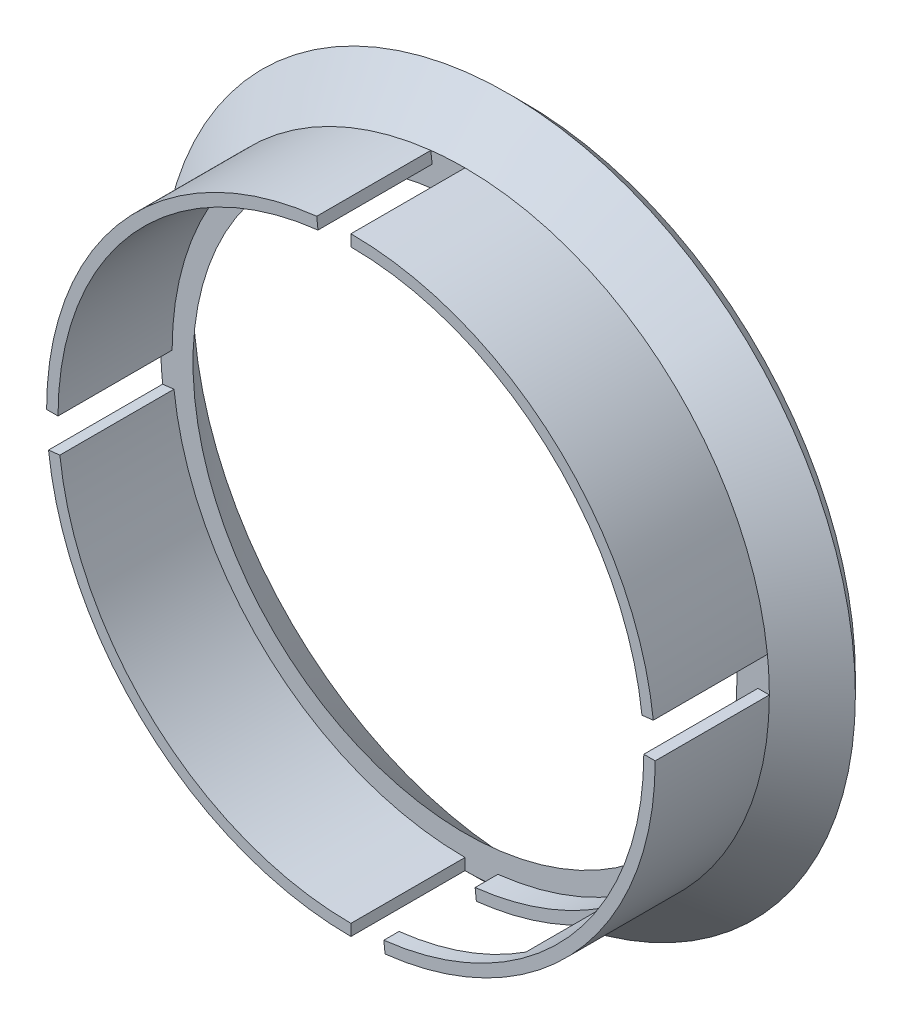
ISO-10303-21;
HEADER;
FILE_DESCRIPTION(('STEP AP214'),'2;1');
FILE_NAME('part.step','',(''),(''),'','','');
FILE_SCHEMA(('AUTOMOTIVE_DESIGN { 1 0 10303 214 1 1 1 1 }'));
ENDSEC;
DATA;
#1=APPLICATION_CONTEXT('core data for automotive mechanical design processes');
#2=APPLICATION_PROTOCOL_DEFINITION('international standard','automotive_design',2000,#1);
#3=PRODUCT_CONTEXT('',#1,'mechanical');
#4=PRODUCT('Part','Part','',(#3));
#5=PRODUCT_RELATED_PRODUCT_CATEGORY('part','',(#4));
#6=PRODUCT_DEFINITION_FORMATION('','',#4);
#7=PRODUCT_DEFINITION_CONTEXT('part definition',#1,'design');
#8=PRODUCT_DEFINITION('design','',#6,#7);
#9=PRODUCT_DEFINITION_SHAPE('','',#8);
#10=(LENGTH_UNIT() NAMED_UNIT(*) SI_UNIT(.MILLI.,.METRE.));
#11=(NAMED_UNIT(*) PLANE_ANGLE_UNIT() SI_UNIT($,.RADIAN.));
#12=(NAMED_UNIT(*) SI_UNIT($,.STERADIAN.) SOLID_ANGLE_UNIT());
#13=UNCERTAINTY_MEASURE_WITH_UNIT(LENGTH_MEASURE(1.E-05),#10,'distance_accuracy_value','');
#14=(GEOMETRIC_REPRESENTATION_CONTEXT(3) GLOBAL_UNCERTAINTY_ASSIGNED_CONTEXT((#13)) GLOBAL_UNIT_ASSIGNED_CONTEXT((#10,
#11,#12)) REPRESENTATION_CONTEXT('',''));
#15=CARTESIAN_POINT('',(0.,0.,0.));
#16=DIRECTION('',(0.,0.,1.));
#17=DIRECTION('',(1.,0.,0.));
#18=AXIS2_PLACEMENT_3D('',#15,#16,#17);
#19=CARTESIAN_POINT('',(0.,0.,15.));
#20=DIRECTION('',(-0.993671875,-0.112321880477423,0.));
#21=DIRECTION('',(0.112321880477423,-0.993671875,0.));
#22=AXIS2_PLACEMENT_3D('',#19,#20,#21);
#23=PLANE('',#22);
#24=DIRECTION('',(0.112321880477423,-0.993671875,0.));
#25=VECTOR('',#24,1.);
#26=CARTESIAN_POINT('',(5.04545822385321,-44.6353810336905,13.));
#27=LINE('',#26,#25);
#28=CARTESIAN_POINT('',(4.32439239838076,-38.2563671875,13.));
#29=VERTEX_POINT('',#28);
#30=CARTESIAN_POINT('',(4.4928752190969,-39.746875,13.));
#31=VERTEX_POINT('',#30);
#32=EDGE_CURVE('E190',#29,#31,#27,.T.);
#33=ORIENTED_EDGE('',*,*,#32,.T.);
#34=DIRECTION('',(0.,0.,-1.));
#35=VECTOR('',#34,1.);
#36=CARTESIAN_POINT('',(4.4928752190969,-39.746875,15.));
#37=LINE('',#36,#35);
#38=CARTESIAN_POINT('',(4.4928752190969,-39.746875,15.));
#39=VERTEX_POINT('',#38);
#40=EDGE_CURVE('E203',#39,#31,#37,.T.);
#41=ORIENTED_EDGE('',*,*,#40,.F.);
#42=DIRECTION('',(-0.112321880477423,0.993671875,0.));
#43=VECTOR('',#42,1.);
#44=CARTESIAN_POINT('',(0.,0.,15.));
#45=LINE('',#44,#43);
#46=CARTESIAN_POINT('',(4.32439239838076,-38.2563671875,15.));
#47=VERTEX_POINT('',#46);
#48=EDGE_CURVE('E478',#39,#47,#45,.T.);
#49=ORIENTED_EDGE('',*,*,#48,.T.);
#50=DIRECTION('',(0.,0.,-1.));
#51=VECTOR('',#50,1.);
#52=CARTESIAN_POINT('',(4.32439239838076,-38.2563671875,15.));
#53=LINE('',#52,#51);
#54=EDGE_CURVE('E205',#47,#29,#53,.T.);
#55=ORIENTED_EDGE('',*,*,#54,.T.);
#56=EDGE_LOOP('',(#33,#41,#49,#55));
#57=FACE_BOUND('',#56,.T.);
#58=ADVANCED_FACE('F47',(#57),#23,.T.);
#59=CARTESIAN_POINT('',(0.,0.,15.));
#60=DIRECTION('',(0.,0.,-1.));
#61=DIRECTION('',(-1.,0.,0.));
#62=AXIS2_PLACEMENT_3D('',#59,#60,#61);
#63=CYLINDRICAL_SURFACE('',#62,38.5);
#64=CARTESIAN_POINT('',(0.,0.,0.));
#65=DIRECTION('',(0.,0.,1.));
#66=DIRECTION('',(1.,0.,0.));
#67=AXIS2_PLACEMENT_3D('',#64,#65,#66);
#68=CIRCLE('',#67,38.5);
#69=CARTESIAN_POINT('',(-4.32439239838076,38.2563671875,0.));
#70=VERTEX_POINT('',#69);
#71=CARTESIAN_POINT('',(-38.5,0.,0.));
#72=VERTEX_POINT('',#71);
#73=EDGE_CURVE('E329',#70,#72,#68,.T.);
#74=ORIENTED_EDGE('',*,*,#73,.F.);
#75=DIRECTION('',(0.,0.,-1.));
#76=VECTOR('',#75,1.);
#77=CARTESIAN_POINT('',(-4.32439239838076,38.2563671875,15.));
#78=LINE('',#77,#76);
#79=CARTESIAN_POINT('',(-4.32439239838076,38.2563671875,15.));
#80=VERTEX_POINT('',#79);
#81=EDGE_CURVE('E11',#80,#70,#78,.T.);
#82=ORIENTED_EDGE('',*,*,#81,.F.);
#83=CARTESIAN_POINT('',(0.,0.,15.));
#84=DIRECTION('',(0.,0.,1.));
#85=DIRECTION('',(1.,0.,0.));
#86=AXIS2_PLACEMENT_3D('',#83,#84,#85);
#87=CIRCLE('',#86,38.5);
#88=CARTESIAN_POINT('',(-38.5,0.,15.));
#89=VERTEX_POINT('',#88);
#90=EDGE_CURVE('E332',#80,#89,#87,.T.);
#91=ORIENTED_EDGE('',*,*,#90,.T.);
#92=DIRECTION('',(0.,0.,-1.));
#93=VECTOR('',#92,1.);
#94=CARTESIAN_POINT('',(-38.5,0.,15.));
#95=LINE('',#94,#93);
#96=EDGE_CURVE('E348',#89,#72,#95,.T.);
#97=ORIENTED_EDGE('',*,*,#96,.T.);
#98=EDGE_LOOP('',(#74,#82,#91,#97));
#99=FACE_BOUND('',#98,.T.);
#100=ADVANCED_FACE('F49',(#99),#63,.F.);
#101=CARTESIAN_POINT('',(0.,0.,15.));
#102=DIRECTION('',(0.993671875,0.112321880477423,0.));
#103=DIRECTION('',(-0.112321880477423,0.993671875,0.));
#104=AXIS2_PLACEMENT_3D('',#101,#102,#103);
#105=PLANE('',#104);
#106=DIRECTION('',(0.112321880477423,-0.993671875,0.));
#107=VECTOR('',#106,1.);
#108=CARTESIAN_POINT('',(0.,0.,0.));
#109=LINE('',#108,#107);
#110=CARTESIAN_POINT('',(-4.4928752190969,39.746875,0.));
#111=VERTEX_POINT('',#110);
#112=EDGE_CURVE('E352',#111,#70,#109,.T.);
#113=ORIENTED_EDGE('',*,*,#112,.F.);
#114=DIRECTION('',(0.,0.,-1.));
#115=VECTOR('',#114,1.);
#116=CARTESIAN_POINT('',(-4.4928752190969,39.746875,15.));
#117=LINE('',#116,#115);
#118=CARTESIAN_POINT('',(-4.4928752190969,39.746875,15.));
#119=VERTEX_POINT('',#118);
#120=EDGE_CURVE('E56',#119,#111,#117,.T.);
#121=ORIENTED_EDGE('',*,*,#120,.F.);
#122=DIRECTION('',(0.112321880477423,-0.993671875,0.));
#123=VECTOR('',#122,1.);
#124=CARTESIAN_POINT('',(0.,0.,15.));
#125=LINE('',#124,#123);
#126=EDGE_CURVE('E336',#119,#80,#125,.T.);
#127=ORIENTED_EDGE('',*,*,#126,.T.);
#128=ORIENTED_EDGE('',*,*,#81,.T.);
#129=EDGE_LOOP('',(#113,#121,#127,#128));
#130=FACE_BOUND('',#129,.T.);
#131=ADVANCED_FACE('F377',(#130),#105,.T.);
#132=CARTESIAN_POINT('',(0.,0.,15.));
#133=DIRECTION('',(0.,0.,-1.));
#134=DIRECTION('',(-1.,0.,0.));
#135=AXIS2_PLACEMENT_3D('',#132,#133,#134);
#136=CYLINDRICAL_SURFACE('',#135,40.);
#137=CARTESIAN_POINT('',(0.,0.,0.));
#138=DIRECTION('',(0.,0.,1.));
#139=DIRECTION('',(1.,0.,0.));
#140=AXIS2_PLACEMENT_3D('',#137,#138,#139);
#141=CIRCLE('',#140,40.);
#142=CARTESIAN_POINT('',(-40.,0.,0.));
#143=VERTEX_POINT('',#142);
#144=EDGE_CURVE('E356',#111,#143,#141,.T.);
#145=ORIENTED_EDGE('',*,*,#144,.T.);
#146=DIRECTION('',(0.,0.,-1.));
#147=VECTOR('',#146,1.);
#148=CARTESIAN_POINT('',(-40.,0.,15.));
#149=LINE('',#148,#147);
#150=CARTESIAN_POINT('',(-40.,0.,15.));
#151=VERTEX_POINT('',#150);
#152=EDGE_CURVE('E365',#151,#143,#149,.T.);
#153=ORIENTED_EDGE('',*,*,#152,.F.);
#154=CARTESIAN_POINT('',(0.,0.,15.));
#155=DIRECTION('',(0.,0.,1.));
#156=DIRECTION('',(1.,0.,0.));
#157=AXIS2_PLACEMENT_3D('',#154,#155,#156);
#158=CIRCLE('',#157,40.);
#159=EDGE_CURVE('E341',#119,#151,#158,.T.);
#160=ORIENTED_EDGE('',*,*,#159,.F.);
#161=ORIENTED_EDGE('',*,*,#120,.T.);
#162=EDGE_LOOP('',(#145,#153,#160,#161));
#163=FACE_BOUND('',#162,.T.);
#164=ADVANCED_FACE('F372',(#163),#136,.T.);
#165=CARTESIAN_POINT('',(0.,0.,15.));
#166=DIRECTION('',(0.,-1.,0.));
#167=DIRECTION('',(0.,0.,-1.));
#168=AXIS2_PLACEMENT_3D('',#165,#166,#167);
#169=PLANE('',#168);
#170=DIRECTION('',(-1.,0.,0.));
#171=VECTOR('',#170,1.);
#172=CARTESIAN_POINT('',(0.,0.,0.));
#173=LINE('',#172,#171);
#174=EDGE_CURVE('E337',#72,#143,#173,.T.);
#175=ORIENTED_EDGE('',*,*,#174,.F.);
#176=ORIENTED_EDGE('',*,*,#96,.F.);
#177=DIRECTION('',(-1.,0.,0.));
#178=VECTOR('',#177,1.);
#179=CARTESIAN_POINT('',(0.,0.,15.));
#180=LINE('',#179,#178);
#181=EDGE_CURVE('E344',#89,#151,#180,.T.);
#182=ORIENTED_EDGE('',*,*,#181,.T.);
#183=ORIENTED_EDGE('',*,*,#152,.T.);
#184=EDGE_LOOP('',(#175,#176,#182,#183));
#185=FACE_BOUND('',#184,.T.);
#186=ADVANCED_FACE('F694',(#185),#169,.T.);
#187=CARTESIAN_POINT('',(0.,0.,15.));
#188=DIRECTION('',(0.,0.,1.));
#189=DIRECTION('',(1.,0.,0.));
#190=AXIS2_PLACEMENT_3D('',#187,#188,#189);
#191=PLANE('',#190);
#192=ORIENTED_EDGE('',*,*,#90,.F.);
#193=ORIENTED_EDGE('',*,*,#126,.F.);
#194=ORIENTED_EDGE('',*,*,#159,.T.);
#195=ORIENTED_EDGE('',*,*,#181,.F.);
#196=EDGE_LOOP('',(#192,#193,#194,#195));
#197=FACE_BOUND('',#196,.T.);
#198=ADVANCED_FACE('F555',(#197),#191,.T.);
#199=CARTESIAN_POINT('',(-35.7573593128807,0.,0.));
#200=DIRECTION('',(0.,0.,-1.));
#201=DIRECTION('',(-1.,0.,0.));
#202=AXIS2_PLACEMENT_3D('',#199,#200,#201);
#203=PLANE('',#202);
#204=CARTESIAN_POINT('',(0.,0.,0.));
#205=DIRECTION('',(0.,0.,1.));
#206=DIRECTION('',(1.,0.,0.));
#207=AXIS2_PLACEMENT_3D('',#204,#205,#206);
#208=CIRCLE('',#207,35.7573593128807);
#209=CARTESIAN_POINT('',(35.7573593128807,0.,0.));
#210=VERTEX_POINT('',#209);
#211=EDGE_CURVE('E312',#210,#210,#208,.T.);
#212=ORIENTED_EDGE('',*,*,#211,.F.);
#213=EDGE_LOOP('',(#212));
#214=FACE_BOUND('',#213,.T.);
#215=CARTESIAN_POINT('',(0.,0.,0.));
#216=DIRECTION('',(0.,0.,1.));
#217=DIRECTION('',(1.,0.,0.));
#218=AXIS2_PLACEMENT_3D('',#215,#216,#217);
#219=CIRCLE('',#218,40.);
#220=CARTESIAN_POINT('',(0.,-40.,0.));
#221=VERTEX_POINT('',#220);
#222=CARTESIAN_POINT('',(4.4928752190969,-39.746875,0.));
#223=VERTEX_POINT('',#222);
#224=EDGE_CURVE('E330',#221,#223,#219,.T.);
#225=ORIENTED_EDGE('',*,*,#224,.T.);
#226=DIRECTION('',(-0.112321880477423,0.993671875,0.));
#227=VECTOR('',#226,1.);
#228=CARTESIAN_POINT('',(0.,0.,0.));
#229=LINE('',#228,#227);
#230=CARTESIAN_POINT('',(4.32439239838076,-38.2563671875,0.));
#231=VERTEX_POINT('',#230);
#232=EDGE_CURVE('E453',#223,#231,#229,.T.);
#233=ORIENTED_EDGE('',*,*,#232,.T.);
#234=CARTESIAN_POINT('',(0.,0.,0.));
#235=DIRECTION('',(0.,0.,1.));
#236=DIRECTION('',(1.,0.,0.));
#237=AXIS2_PLACEMENT_3D('',#234,#235,#236);
#238=CIRCLE('',#237,38.5);
#239=CARTESIAN_POINT('',(38.5,0.,0.));
#240=VERTEX_POINT('',#239);
#241=EDGE_CURVE('E447',#231,#240,#238,.T.);
#242=ORIENTED_EDGE('',*,*,#241,.T.);
#243=DIRECTION('',(1.,0.,0.));
#244=VECTOR('',#243,1.);
#245=CARTESIAN_POINT('',(0.,0.,0.));
#246=LINE('',#245,#244);
#247=CARTESIAN_POINT('',(40.,0.,0.));
#248=VERTEX_POINT('',#247);
#249=EDGE_CURVE('E467',#240,#248,#246,.T.);
#250=ORIENTED_EDGE('',*,*,#249,.T.);
#251=CARTESIAN_POINT('',(39.746875,4.4928752190969,0.));
#252=VERTEX_POINT('',#251);
#253=EDGE_CURVE('E331',#248,#252,#219,.T.);
#254=ORIENTED_EDGE('',*,*,#253,.T.);
#255=DIRECTION('',(-0.993671875,-0.112321880477422,0.));
#256=VECTOR('',#255,1.);
#257=CARTESIAN_POINT('',(0.,0.,0.));
#258=LINE('',#257,#256);
#259=CARTESIAN_POINT('',(38.2563671875,4.32439239838076,0.));
#260=VERTEX_POINT('',#259);
#261=EDGE_CURVE('E243',#252,#260,#258,.T.);
#262=ORIENTED_EDGE('',*,*,#261,.T.);
#263=CARTESIAN_POINT('',(0.,0.,0.));
#264=DIRECTION('',(0.,0.,1.));
#265=DIRECTION('',(1.,0.,0.));
#266=AXIS2_PLACEMENT_3D('',#263,#264,#265);
#267=CIRCLE('',#266,38.5);
#268=CARTESIAN_POINT('',(0.,38.5,0.));
#269=VERTEX_POINT('',#268);
#270=EDGE_CURVE('E224',#260,#269,#267,.T.);
#271=ORIENTED_EDGE('',*,*,#270,.T.);
#272=DIRECTION('',(0.,-1.,0.));
#273=VECTOR('',#272,1.);
#274=CARTESIAN_POINT('',(0.,0.,0.));
#275=LINE('',#274,#273);
#276=CARTESIAN_POINT('',(0.,40.,0.));
#277=VERTEX_POINT('',#276);
#278=EDGE_CURVE('E230',#277,#269,#275,.T.);
#279=ORIENTED_EDGE('',*,*,#278,.F.);
#280=EDGE_CURVE('E324',#277,#111,#219,.T.);
#281=ORIENTED_EDGE('',*,*,#280,.T.);
#282=ORIENTED_EDGE('',*,*,#112,.T.);
#283=ORIENTED_EDGE('',*,*,#73,.T.);
#284=ORIENTED_EDGE('',*,*,#174,.T.);
#285=CARTESIAN_POINT('',(-39.746875,-4.4928752190969,0.));
#286=VERTEX_POINT('',#285);
#287=EDGE_CURVE('E325',#143,#286,#219,.T.);
#288=ORIENTED_EDGE('',*,*,#287,.T.);
#289=DIRECTION('',(0.993671875,0.112321880477422,0.));
#290=VECTOR('',#289,1.);
#291=CARTESIAN_POINT('',(0.,0.,0.));
#292=LINE('',#291,#290);
#293=CARTESIAN_POINT('',(-38.2563671875,-4.32439239838076,0.));
#294=VERTEX_POINT('',#293);
#295=EDGE_CURVE('E287',#286,#294,#292,.T.);
#296=ORIENTED_EDGE('',*,*,#295,.T.);
#297=CARTESIAN_POINT('',(0.,0.,0.));
#298=DIRECTION('',(0.,0.,1.));
#299=DIRECTION('',(1.,0.,0.));
#300=AXIS2_PLACEMENT_3D('',#297,#298,#299);
#301=CIRCLE('',#300,38.5);
#302=CARTESIAN_POINT('',(0.,-38.5,0.));
#303=VERTEX_POINT('',#302);
#304=EDGE_CURVE('E268',#294,#303,#301,.T.);
#305=ORIENTED_EDGE('',*,*,#304,.T.);
#306=DIRECTION('',(0.,1.,0.));
#307=VECTOR('',#306,1.);
#308=CARTESIAN_POINT('',(0.,0.,0.));
#309=LINE('',#308,#307);
#310=EDGE_CURVE('E274',#221,#303,#309,.T.);
#311=ORIENTED_EDGE('',*,*,#310,.F.);
#312=EDGE_LOOP('',(#225,#233,#242,#250,#254,#262,#271,#279,#281,#282,#283,#284,#288,#296,#305,#311));
#313=FACE_BOUND('',#312,.T.);
#314=ADVANCED_FACE('F386',(#214,#313),#203,.F.);
#315=CARTESIAN_POINT('',(0.,0.,-5.65685424949239));
#316=DIRECTION('',(0.,0.,-1.));
#317=DIRECTION('',(-1.,0.,0.));
#318=AXIS2_PLACEMENT_3D('',#315,#316,#317);
#319=CONICAL_SURFACE('',#318,45.6568542494924,0.785398163397446);
#320=ORIENTED_EDGE('',*,*,#144,.F.);
#321=ORIENTED_EDGE('',*,*,#280,.F.);
#322=CARTESIAN_POINT('',(0.,0.,0.));
#323=DIRECTION('',(0.,0.,1.));
#324=DIRECTION('',(1.,0.,0.));
#325=AXIS2_PLACEMENT_3D('',#322,#323,#324);
#326=CIRCLE('',#325,40.);
#327=EDGE_CURVE('E246',#252,#277,#326,.T.);
#328=ORIENTED_EDGE('',*,*,#327,.F.);
#329=ORIENTED_EDGE('',*,*,#253,.F.);
#330=CARTESIAN_POINT('',(0.,0.,0.));
#331=DIRECTION('',(0.,0.,1.));
#332=DIRECTION('',(1.,0.,0.));
#333=AXIS2_PLACEMENT_3D('',#330,#331,#332);
#334=CIRCLE('',#333,40.);
#335=EDGE_CURVE('E457',#223,#248,#334,.T.);
#336=ORIENTED_EDGE('',*,*,#335,.F.);
#337=ORIENTED_EDGE('',*,*,#224,.F.);
#338=CARTESIAN_POINT('',(0.,0.,0.));
#339=DIRECTION('',(0.,0.,1.));
#340=DIRECTION('',(1.,0.,0.));
#341=AXIS2_PLACEMENT_3D('',#338,#339,#340);
#342=CIRCLE('',#341,40.);
#343=EDGE_CURVE('E290',#286,#221,#342,.T.);
#344=ORIENTED_EDGE('',*,*,#343,.F.);
#345=ORIENTED_EDGE('',*,*,#287,.F.);
#346=EDGE_LOOP('',(#320,#321,#328,#329,#336,#337,#344,#345));
#347=FACE_BOUND('',#346,.T.);
#348=CARTESIAN_POINT('',(0.,0.,-5.65685424949239));
#349=DIRECTION('',(0.,0.,1.));
#350=DIRECTION('',(1.,0.,0.));
#351=AXIS2_PLACEMENT_3D('',#348,#349,#350);
#352=CIRCLE('',#351,45.6568542494924);
#353=CARTESIAN_POINT('',(45.6568542494924,0.,-5.65685424949239));
#354=VERTEX_POINT('',#353);
#355=EDGE_CURVE('E320',#354,#354,#352,.T.);
#356=ORIENTED_EDGE('',*,*,#355,.T.);
#357=EDGE_LOOP('',(#356));
#358=FACE_BOUND('',#357,.T.);
#359=ADVANCED_FACE('F381',(#347,#358),#319,.T.);
#360=CARTESIAN_POINT('',(0.,0.,-7.77817459305203));
#361=DIRECTION('',(0.,0.,1.));
#362=DIRECTION('',(1.,0.,0.));
#363=AXIS2_PLACEMENT_3D('',#360,#361,#362);
#364=CONICAL_SURFACE('',#363,43.5355339059327,0.785398163397447);
#365=ORIENTED_EDGE('',*,*,#355,.F.);
#366=EDGE_LOOP('',(#365));
#367=FACE_BOUND('',#366,.T.);
#368=CARTESIAN_POINT('',(0.,0.,-7.77817459305203));
#369=DIRECTION('',(0.,0.,1.));
#370=DIRECTION('',(1.,0.,0.));
#371=AXIS2_PLACEMENT_3D('',#368,#369,#370);
#372=CIRCLE('',#371,43.5355339059327);
#373=CARTESIAN_POINT('',(43.5355339059327,0.,-7.77817459305203));
#374=VERTEX_POINT('',#373);
#375=EDGE_CURVE('E316',#374,#374,#372,.T.);
#376=ORIENTED_EDGE('',*,*,#375,.T.);
#377=EDGE_LOOP('',(#376));
#378=FACE_BOUND('',#377,.T.);
#379=ADVANCED_FACE('F564',(#367,#378),#364,.T.);
#380=CARTESIAN_POINT('',(0.,0.,0.));
#381=DIRECTION('',(0.,0.,-1.));
#382=DIRECTION('',(-1.,0.,0.));
#383=AXIS2_PLACEMENT_3D('',#380,#381,#382);
#384=CONICAL_SURFACE('',#383,35.7573593128807,0.785398163397447);
#385=ORIENTED_EDGE('',*,*,#375,.F.);
#386=EDGE_LOOP('',(#385));
#387=FACE_BOUND('',#386,.T.);
#388=ORIENTED_EDGE('',*,*,#211,.T.);
#389=EDGE_LOOP('',(#388));
#390=FACE_BOUND('',#389,.T.);
#391=ADVANCED_FACE('F572',(#387,#390),#384,.F.);
#392=CARTESIAN_POINT('',(0.,0.,15.));
#393=DIRECTION('',(0.,0.,-1.));
#394=DIRECTION('',(-1.,0.,0.));
#395=AXIS2_PLACEMENT_3D('',#392,#393,#394);
#396=CYLINDRICAL_SURFACE('',#395,38.5);
#397=ORIENTED_EDGE('',*,*,#304,.F.);
#398=DIRECTION('',(0.,0.,-1.));
#399=VECTOR('',#398,1.);
#400=CARTESIAN_POINT('',(-38.2563671875,-4.32439239838076,15.));
#401=LINE('',#400,#399);
#402=CARTESIAN_POINT('',(-38.2563671875,-4.32439239838076,15.));
#403=VERTEX_POINT('',#402);
#404=EDGE_CURVE('E308',#403,#294,#401,.T.);
#405=ORIENTED_EDGE('',*,*,#404,.F.);
#406=CARTESIAN_POINT('',(0.,0.,15.));
#407=DIRECTION('',(0.,0.,1.));
#408=DIRECTION('',(1.,0.,0.));
#409=AXIS2_PLACEMENT_3D('',#406,#407,#408);
#410=CIRCLE('',#409,38.5);
#411=CARTESIAN_POINT('',(0.,-38.5,15.));
#412=VERTEX_POINT('',#411);
#413=EDGE_CURVE('E269',#403,#412,#410,.T.);
#414=ORIENTED_EDGE('',*,*,#413,.T.);
#415=DIRECTION('',(0.,0.,-1.));
#416=VECTOR('',#415,1.);
#417=CARTESIAN_POINT('',(0.,-38.5,15.));
#418=LINE('',#417,#416);
#419=EDGE_CURVE('E284',#412,#303,#418,.T.);
#420=ORIENTED_EDGE('',*,*,#419,.T.);
#421=EDGE_LOOP('',(#397,#405,#414,#420));
#422=FACE_BOUND('',#421,.T.);
#423=ADVANCED_FACE('F399',(#422),#396,.F.);
#424=CARTESIAN_POINT('',(0.,0.,15.));
#425=DIRECTION('',(-0.112321880477422,0.993671875,0.));
#426=DIRECTION('',(-0.993671875,-0.112321880477422,0.));
#427=AXIS2_PLACEMENT_3D('',#424,#425,#426);
#428=PLANE('',#427);
#429=ORIENTED_EDGE('',*,*,#295,.F.);
#430=DIRECTION('',(0.,0.,-1.));
#431=VECTOR('',#430,1.);
#432=CARTESIAN_POINT('',(-39.746875,-4.4928752190969,15.));
#433=LINE('',#432,#431);
#434=CARTESIAN_POINT('',(-39.746875,-4.4928752190969,15.));
#435=VERTEX_POINT('',#434);
#436=EDGE_CURVE('E304',#435,#286,#433,.T.);
#437=ORIENTED_EDGE('',*,*,#436,.F.);
#438=DIRECTION('',(0.993671875,0.112321880477422,0.));
#439=VECTOR('',#438,1.);
#440=CARTESIAN_POINT('',(0.,0.,15.));
#441=LINE('',#440,#439);
#442=EDGE_CURVE('E273',#435,#403,#441,.T.);
#443=ORIENTED_EDGE('',*,*,#442,.T.);
#444=ORIENTED_EDGE('',*,*,#404,.T.);
#445=EDGE_LOOP('',(#429,#437,#443,#444));
#446=FACE_BOUND('',#445,.T.);
#447=ADVANCED_FACE('F395',(#446),#428,.T.);
#448=CARTESIAN_POINT('',(0.,0.,15.));
#449=DIRECTION('',(0.,0.,-1.));
#450=DIRECTION('',(-1.,0.,0.));
#451=AXIS2_PLACEMENT_3D('',#448,#449,#450);
#452=CYLINDRICAL_SURFACE('',#451,40.);
#453=ORIENTED_EDGE('',*,*,#343,.T.);
#454=DIRECTION('',(0.,0.,-1.));
#455=VECTOR('',#454,1.);
#456=CARTESIAN_POINT('',(0.,-40.,15.));
#457=LINE('',#456,#455);
#458=CARTESIAN_POINT('',(0.,-40.,15.));
#459=VERTEX_POINT('',#458);
#460=EDGE_CURVE('E300',#459,#221,#457,.T.);
#461=ORIENTED_EDGE('',*,*,#460,.F.);
#462=CARTESIAN_POINT('',(0.,0.,15.));
#463=DIRECTION('',(0.,0.,1.));
#464=DIRECTION('',(1.,0.,0.));
#465=AXIS2_PLACEMENT_3D('',#462,#463,#464);
#466=CIRCLE('',#465,40.);
#467=EDGE_CURVE('E278',#435,#459,#466,.T.);
#468=ORIENTED_EDGE('',*,*,#467,.F.);
#469=ORIENTED_EDGE('',*,*,#436,.T.);
#470=EDGE_LOOP('',(#453,#461,#468,#469));
#471=FACE_BOUND('',#470,.T.);
#472=ADVANCED_FACE('F391',(#471),#452,.T.);
#473=CARTESIAN_POINT('',(0.,0.,15.));
#474=DIRECTION('',(-1.,0.,0.));
#475=DIRECTION('',(0.,0.,1.));
#476=AXIS2_PLACEMENT_3D('',#473,#474,#475);
#477=PLANE('',#476);
#478=ORIENTED_EDGE('',*,*,#310,.T.);
#479=ORIENTED_EDGE('',*,*,#419,.F.);
#480=DIRECTION('',(0.,1.,0.));
#481=VECTOR('',#480,1.);
#482=CARTESIAN_POINT('',(0.,0.,15.));
#483=LINE('',#482,#481);
#484=EDGE_CURVE('E281',#459,#412,#483,.T.);
#485=ORIENTED_EDGE('',*,*,#484,.F.);
#486=ORIENTED_EDGE('',*,*,#460,.T.);
#487=EDGE_LOOP('',(#478,#479,#485,#486));
#488=FACE_BOUND('',#487,.T.);
#489=ADVANCED_FACE('F403',(#488),#477,.F.);
#490=CARTESIAN_POINT('',(0.,0.,15.));
#491=DIRECTION('',(0.,0.,1.));
#492=DIRECTION('',(1.,0.,0.));
#493=AXIS2_PLACEMENT_3D('',#490,#491,#492);
#494=PLANE('',#493);
#495=ORIENTED_EDGE('',*,*,#413,.F.);
#496=ORIENTED_EDGE('',*,*,#442,.F.);
#497=ORIENTED_EDGE('',*,*,#467,.T.);
#498=ORIENTED_EDGE('',*,*,#484,.T.);
#499=EDGE_LOOP('',(#495,#496,#497,#498));
#500=FACE_BOUND('',#499,.T.);
#501=ADVANCED_FACE('F406',(#500),#494,.T.);
#502=CARTESIAN_POINT('',(0.,0.,15.));
#503=DIRECTION('',(0.,0.,-1.));
#504=DIRECTION('',(-1.,0.,0.));
#505=AXIS2_PLACEMENT_3D('',#502,#503,#504);
#506=CYLINDRICAL_SURFACE('',#505,38.5);
#507=ORIENTED_EDGE('',*,*,#270,.F.);
#508=DIRECTION('',(0.,0.,-1.));
#509=VECTOR('',#508,1.);
#510=CARTESIAN_POINT('',(38.2563671875,4.32439239838076,15.));
#511=LINE('',#510,#509);
#512=CARTESIAN_POINT('',(38.2563671875,4.32439239838076,15.));
#513=VERTEX_POINT('',#512);
#514=EDGE_CURVE('E264',#513,#260,#511,.T.);
#515=ORIENTED_EDGE('',*,*,#514,.F.);
#516=CARTESIAN_POINT('',(0.,0.,15.));
#517=DIRECTION('',(0.,0.,1.));
#518=DIRECTION('',(1.,0.,0.));
#519=AXIS2_PLACEMENT_3D('',#516,#517,#518);
#520=CIRCLE('',#519,38.5);
#521=CARTESIAN_POINT('',(0.,38.5,15.));
#522=VERTEX_POINT('',#521);
#523=EDGE_CURVE('E225',#513,#522,#520,.T.);
#524=ORIENTED_EDGE('',*,*,#523,.T.);
#525=DIRECTION('',(0.,0.,-1.));
#526=VECTOR('',#525,1.);
#527=CARTESIAN_POINT('',(0.,38.5,15.));
#528=LINE('',#527,#526);
#529=EDGE_CURVE('E240',#522,#269,#528,.T.);
#530=ORIENTED_EDGE('',*,*,#529,.T.);
#531=EDGE_LOOP('',(#507,#515,#524,#530));
#532=FACE_BOUND('',#531,.T.);
#533=ADVANCED_FACE('F408',(#532),#506,.F.);
#534=CARTESIAN_POINT('',(0.,0.,15.));
#535=DIRECTION('',(0.112321880477422,-0.993671875,0.));
#536=DIRECTION('',(0.993671875,0.112321880477422,0.));
#537=AXIS2_PLACEMENT_3D('',#534,#535,#536);
#538=PLANE('',#537);
#539=ORIENTED_EDGE('',*,*,#261,.F.);
#540=DIRECTION('',(0.,0.,-1.));
#541=VECTOR('',#540,1.);
#542=CARTESIAN_POINT('',(39.746875,4.4928752190969,15.));
#543=LINE('',#542,#541);
#544=CARTESIAN_POINT('',(39.746875,4.4928752190969,15.));
#545=VERTEX_POINT('',#544);
#546=EDGE_CURVE('E260',#545,#252,#543,.T.);
#547=ORIENTED_EDGE('',*,*,#546,.F.);
#548=DIRECTION('',(-0.993671875,-0.112321880477422,0.));
#549=VECTOR('',#548,1.);
#550=CARTESIAN_POINT('',(0.,0.,15.));
#551=LINE('',#550,#549);
#552=EDGE_CURVE('E229',#545,#513,#551,.T.);
#553=ORIENTED_EDGE('',*,*,#552,.T.);
#554=ORIENTED_EDGE('',*,*,#514,.T.);
#555=EDGE_LOOP('',(#539,#547,#553,#554));
#556=FACE_BOUND('',#555,.T.);
#557=ADVANCED_FACE('F414',(#556),#538,.T.);
#558=CARTESIAN_POINT('',(0.,0.,15.));
#559=DIRECTION('',(0.,0.,-1.));
#560=DIRECTION('',(-1.,0.,0.));
#561=AXIS2_PLACEMENT_3D('',#558,#559,#560);
#562=CYLINDRICAL_SURFACE('',#561,40.);
#563=ORIENTED_EDGE('',*,*,#327,.T.);
#564=DIRECTION('',(0.,0.,-1.));
#565=VECTOR('',#564,1.);
#566=CARTESIAN_POINT('',(0.,40.,15.));
#567=LINE('',#566,#565);
#568=CARTESIAN_POINT('',(0.,40.,15.));
#569=VERTEX_POINT('',#568);
#570=EDGE_CURVE('E256',#569,#277,#567,.T.);
#571=ORIENTED_EDGE('',*,*,#570,.F.);
#572=CARTESIAN_POINT('',(0.,0.,15.));
#573=DIRECTION('',(0.,0.,1.));
#574=DIRECTION('',(1.,0.,0.));
#575=AXIS2_PLACEMENT_3D('',#572,#573,#574);
#576=CIRCLE('',#575,40.);
#577=EDGE_CURVE('E234',#545,#569,#576,.T.);
#578=ORIENTED_EDGE('',*,*,#577,.F.);
#579=ORIENTED_EDGE('',*,*,#546,.T.);
#580=EDGE_LOOP('',(#563,#571,#578,#579));
#581=FACE_BOUND('',#580,.T.);
#582=ADVANCED_FACE('F633',(#581),#562,.T.);
#583=CARTESIAN_POINT('',(0.,0.,15.));
#584=DIRECTION('',(1.,0.,0.));
#585=DIRECTION('',(0.,0.,-1.));
#586=AXIS2_PLACEMENT_3D('',#583,#584,#585);
#587=PLANE('',#586);
#588=ORIENTED_EDGE('',*,*,#278,.T.);
#589=ORIENTED_EDGE('',*,*,#529,.F.);
#590=DIRECTION('',(0.,-1.,0.));
#591=VECTOR('',#590,1.);
#592=CARTESIAN_POINT('',(0.,0.,15.));
#593=LINE('',#592,#591);
#594=EDGE_CURVE('E237',#569,#522,#593,.T.);
#595=ORIENTED_EDGE('',*,*,#594,.F.);
#596=ORIENTED_EDGE('',*,*,#570,.T.);
#597=EDGE_LOOP('',(#588,#589,#595,#596));
#598=FACE_BOUND('',#597,.T.);
#599=ADVANCED_FACE('F643',(#598),#587,.F.);
#600=CARTESIAN_POINT('',(0.,0.,15.));
#601=DIRECTION('',(0.,0.,1.));
#602=DIRECTION('',(1.,0.,0.));
#603=AXIS2_PLACEMENT_3D('',#600,#601,#602);
#604=PLANE('',#603);
#605=ORIENTED_EDGE('',*,*,#523,.F.);
#606=ORIENTED_EDGE('',*,*,#552,.F.);
#607=ORIENTED_EDGE('',*,*,#577,.T.);
#608=ORIENTED_EDGE('',*,*,#594,.T.);
#609=EDGE_LOOP('',(#605,#606,#607,#608));
#610=FACE_BOUND('',#609,.T.);
#611=ADVANCED_FACE('F435',(#610),#604,.T.);
#612=CARTESIAN_POINT('',(0.,0.,15.));
#613=DIRECTION('',(0.,0.,-1.));
#614=DIRECTION('',(-1.,0.,0.));
#615=AXIS2_PLACEMENT_3D('',#612,#613,#614);
#616=CYLINDRICAL_SURFACE('',#615,38.5);
#617=CARTESIAN_POINT('',(0.,0.,13.));
#618=DIRECTION('',(0.,0.,1.));
#619=DIRECTION('',(1.,0.,0.));
#620=AXIS2_PLACEMENT_3D('',#617,#618,#619);
#621=CIRCLE('',#620,38.5);
#622=CARTESIAN_POINT('',(21.,-32.2684056005251,13.));
#623=VERTEX_POINT('',#622);
#624=EDGE_CURVE('E207',#623,#29,#621,.F.);
#625=ORIENTED_EDGE('',*,*,#624,.T.);
#626=ORIENTED_EDGE('',*,*,#54,.F.);
#627=CARTESIAN_POINT('',(0.,0.,15.));
#628=DIRECTION('',(0.,0.,1.));
#629=DIRECTION('',(1.,0.,0.));
#630=AXIS2_PLACEMENT_3D('',#627,#628,#629);
#631=CIRCLE('',#630,38.5);
#632=CARTESIAN_POINT('',(38.5,0.,15.));
#633=VERTEX_POINT('',#632);
#634=EDGE_CURVE('E469',#47,#633,#631,.T.);
#635=ORIENTED_EDGE('',*,*,#634,.T.);
#636=DIRECTION('',(0.,0.,-1.));
#637=VECTOR('',#636,1.);
#638=CARTESIAN_POINT('',(38.5,0.,15.));
#639=LINE('',#638,#637);
#640=EDGE_CURVE('E449',#633,#240,#639,.T.);
#641=ORIENTED_EDGE('',*,*,#640,.T.);
#642=ORIENTED_EDGE('',*,*,#241,.F.);
#643=CARTESIAN_POINT('',(4.32439239838076,-38.2563671875,3.));
#644=VERTEX_POINT('',#643);
#645=EDGE_CURVE('E70',#644,#231,#53,.T.);
#646=ORIENTED_EDGE('',*,*,#645,.F.);
#647=CARTESIAN_POINT('',(0.,0.,3.));
#648=DIRECTION('',(0.,0.,-1.));
#649=DIRECTION('',(-1.,0.,0.));
#650=AXIS2_PLACEMENT_3D('',#647,#648,#649);
#651=CIRCLE('',#650,38.5);
#652=CARTESIAN_POINT('',(21.,-32.2684056005251,3.));
#653=VERTEX_POINT('',#652);
#654=EDGE_CURVE('E445',#644,#653,#651,.F.);
#655=ORIENTED_EDGE('',*,*,#654,.T.);
#656=DIRECTION('',(0.,0.,-1.));
#657=VECTOR('',#656,1.);
#658=CARTESIAN_POINT('',(21.,-32.2684056005251,15.));
#659=LINE('',#658,#657);
#660=EDGE_CURVE('E439',#653,#623,#659,.F.);
#661=ORIENTED_EDGE('',*,*,#660,.T.);
#662=EDGE_LOOP('',(#625,#626,#635,#641,#642,#646,#655,#661));
#663=FACE_BOUND('',#662,.T.);
#664=ADVANCED_FACE('F430',(#663),#616,.F.);
#665=DIRECTION('',(-0.112321880477423,0.993671875,0.));
#666=VECTOR('',#665,1.);
#667=CARTESIAN_POINT('',(5.04545822385321,-44.6353810336905,3.));
#668=LINE('',#667,#666);
#669=CARTESIAN_POINT('',(4.4928752190969,-39.746875,3.));
#670=VERTEX_POINT('',#669);
#671=EDGE_CURVE('E63',#670,#644,#668,.T.);
#672=ORIENTED_EDGE('',*,*,#671,.T.);
#673=ORIENTED_EDGE('',*,*,#645,.T.);
#674=ORIENTED_EDGE('',*,*,#232,.F.);
#675=EDGE_CURVE('E214',#670,#223,#37,.T.);
#676=ORIENTED_EDGE('',*,*,#675,.F.);
#677=EDGE_LOOP('',(#672,#673,#674,#676));
#678=FACE_BOUND('',#677,.T.);
#679=ADVANCED_FACE('F420',(#678),#23,.T.);
#680=CARTESIAN_POINT('',(0.,0.,15.));
#681=DIRECTION('',(0.,0.,-1.));
#682=DIRECTION('',(-1.,0.,0.));
#683=AXIS2_PLACEMENT_3D('',#680,#681,#682);
#684=CYLINDRICAL_SURFACE('',#683,40.);
#685=ORIENTED_EDGE('',*,*,#40,.T.);
#686=CARTESIAN_POINT('',(0.,0.,13.));
#687=DIRECTION('',(0.,0.,1.));
#688=DIRECTION('',(1.,0.,0.));
#689=AXIS2_PLACEMENT_3D('',#686,#687,#688);
#690=CIRCLE('',#689,40.);
#691=CARTESIAN_POINT('',(21.,-34.0440890610984,13.));
#692=VERTEX_POINT('',#691);
#693=EDGE_CURVE('E186',#692,#31,#690,.F.);
#694=ORIENTED_EDGE('',*,*,#693,.F.);
#695=DIRECTION('',(0.,0.,-1.));
#696=VECTOR('',#695,1.);
#697=CARTESIAN_POINT('',(21.,-34.0440890610984,15.));
#698=LINE('',#697,#696);
#699=CARTESIAN_POINT('',(21.,-34.0440890610984,3.));
#700=VERTEX_POINT('',#699);
#701=EDGE_CURVE('E495',#700,#692,#698,.F.);
#702=ORIENTED_EDGE('',*,*,#701,.F.);
#703=CARTESIAN_POINT('',(0.,0.,3.));
#704=DIRECTION('',(0.,0.,-1.));
#705=DIRECTION('',(-1.,0.,0.));
#706=AXIS2_PLACEMENT_3D('',#703,#704,#705);
#707=CIRCLE('',#706,40.);
#708=EDGE_CURVE('E440',#670,#700,#707,.F.);
#709=ORIENTED_EDGE('',*,*,#708,.F.);
#710=ORIENTED_EDGE('',*,*,#675,.T.);
#711=ORIENTED_EDGE('',*,*,#335,.T.);
#712=DIRECTION('',(0.,0.,-1.));
#713=VECTOR('',#712,1.);
#714=CARTESIAN_POINT('',(40.,0.,15.));
#715=LINE('',#714,#713);
#716=CARTESIAN_POINT('',(40.,0.,15.));
#717=VERTEX_POINT('',#716);
#718=EDGE_CURVE('E219',#717,#248,#715,.T.);
#719=ORIENTED_EDGE('',*,*,#718,.F.);
#720=CARTESIAN_POINT('',(0.,0.,15.));
#721=DIRECTION('',(0.,0.,1.));
#722=DIRECTION('',(1.,0.,0.));
#723=AXIS2_PLACEMENT_3D('',#720,#721,#722);
#724=CIRCLE('',#723,40.);
#725=EDGE_CURVE('E211',#39,#717,#724,.T.);
#726=ORIENTED_EDGE('',*,*,#725,.F.);
#727=EDGE_LOOP('',(#685,#694,#702,#709,#710,#711,#719,#726));
#728=FACE_BOUND('',#727,.T.);
#729=ADVANCED_FACE('F209',(#728),#684,.T.);
#730=CARTESIAN_POINT('',(0.,0.,15.));
#731=DIRECTION('',(0.,1.,0.));
#732=DIRECTION('',(0.,0.,1.));
#733=AXIS2_PLACEMENT_3D('',#730,#731,#732);
#734=PLANE('',#733);
#735=ORIENTED_EDGE('',*,*,#249,.F.);
#736=ORIENTED_EDGE('',*,*,#640,.F.);
#737=DIRECTION('',(1.,0.,0.));
#738=VECTOR('',#737,1.);
#739=CARTESIAN_POINT('',(0.,0.,15.));
#740=LINE('',#739,#738);
#741=EDGE_CURVE('E461',#633,#717,#740,.T.);
#742=ORIENTED_EDGE('',*,*,#741,.T.);
#743=ORIENTED_EDGE('',*,*,#718,.T.);
#744=EDGE_LOOP('',(#735,#736,#742,#743));
#745=FACE_BOUND('',#744,.T.);
#746=ADVANCED_FACE('F434',(#745),#734,.T.);
#747=CARTESIAN_POINT('',(0.,0.,15.));
#748=DIRECTION('',(0.,0.,1.));
#749=DIRECTION('',(1.,0.,0.));
#750=AXIS2_PLACEMENT_3D('',#747,#748,#749);
#751=PLANE('',#750);
#752=ORIENTED_EDGE('',*,*,#634,.F.);
#753=ORIENTED_EDGE('',*,*,#48,.F.);
#754=ORIENTED_EDGE('',*,*,#725,.T.);
#755=ORIENTED_EDGE('',*,*,#741,.F.);
#756=EDGE_LOOP('',(#752,#753,#754,#755));
#757=FACE_BOUND('',#756,.T.);
#758=ADVANCED_FACE('F503',(#757),#751,.T.);
#759=CARTESIAN_POINT('',(-4.00000000000001,-45.6578542494924,13.));
#760=DIRECTION('',(0.,0.,1.));
#761=DIRECTION('',(1.,0.,0.));
#762=AXIS2_PLACEMENT_3D('',#759,#760,#761);
#763=PLANE('',#762);
#764=DIRECTION('',(0.,1.,0.));
#765=VECTOR('',#764,1.);
#766=CARTESIAN_POINT('',(21.,-45.6578542494924,13.));
#767=LINE('',#766,#765);
#768=EDGE_CURVE('E192',#692,#623,#767,.T.);
#769=ORIENTED_EDGE('',*,*,#768,.F.);
#770=ORIENTED_EDGE('',*,*,#693,.T.);
#771=ORIENTED_EDGE('',*,*,#32,.F.);
#772=ORIENTED_EDGE('',*,*,#624,.F.);
#773=EDGE_LOOP('',(#769,#770,#771,#772));
#774=FACE_BOUND('',#773,.T.);
#775=ADVANCED_FACE('F188',(#774),#763,.F.);
#776=CARTESIAN_POINT('',(21.,-45.6578542494924,3.));
#777=DIRECTION('',(1.,0.,0.));
#778=DIRECTION('',(0.,0.,-1.));
#779=AXIS2_PLACEMENT_3D('',#776,#777,#778);
#780=PLANE('',#779);
#781=DIRECTION('',(0.,1.,0.));
#782=VECTOR('',#781,1.);
#783=CARTESIAN_POINT('',(21.,-45.6578542494924,3.));
#784=LINE('',#783,#782);
#785=EDGE_CURVE('E198',#700,#653,#784,.T.);
#786=ORIENTED_EDGE('',*,*,#785,.F.);
#787=ORIENTED_EDGE('',*,*,#701,.T.);
#788=ORIENTED_EDGE('',*,*,#768,.T.);
#789=ORIENTED_EDGE('',*,*,#660,.F.);
#790=EDGE_LOOP('',(#786,#787,#788,#789));
#791=FACE_BOUND('',#790,.T.);
#792=ADVANCED_FACE('F498',(#791),#780,.F.);
#793=CARTESIAN_POINT('',(-4.00000000000001,-45.6578542494924,3.));
#794=DIRECTION('',(0.,0.,-1.));
#795=DIRECTION('',(-1.,0.,0.));
#796=AXIS2_PLACEMENT_3D('',#793,#794,#795);
#797=PLANE('',#796);
#798=ORIENTED_EDGE('',*,*,#671,.F.);
#799=ORIENTED_EDGE('',*,*,#708,.T.);
#800=ORIENTED_EDGE('',*,*,#785,.T.);
#801=ORIENTED_EDGE('',*,*,#654,.F.);
#802=EDGE_LOOP('',(#798,#799,#800,#801));
#803=FACE_BOUND('',#802,.T.);
#804=ADVANCED_FACE('F501',(#803),#797,.F.);
#805=CLOSED_SHELL('',(#58,#100,#131,#164,#186,#198,#314,#359,#379,#391,#423,#447,#472,#489,#501,
#533,#557,#582,#599,#611,#664,#679,#729,#746,#758,#775,#792,#804));
#806=MANIFOLD_SOLID_BREP('B2',#805);
#807=ADVANCED_BREP_SHAPE_REPRESENTATION('',(#18,#806),#14);
#808=SHAPE_DEFINITION_REPRESENTATION(#9,#807);
ENDSEC;
END-ISO-10303-21;
